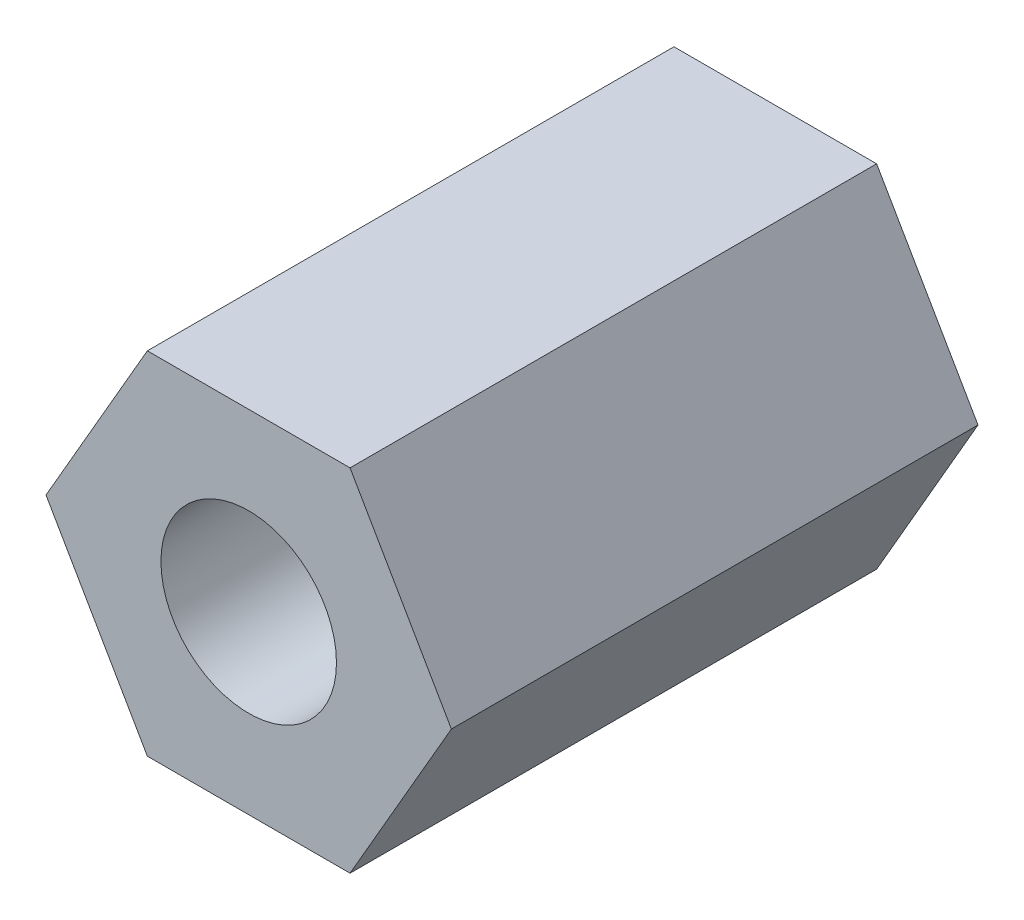
ISO-10303-21;
HEADER;
FILE_DESCRIPTION(('STEP AP214'),'2;1');
FILE_NAME('part.step','',(''),(''),'','','');
FILE_SCHEMA(('AUTOMOTIVE_DESIGN { 1 0 10303 214 1 1 1 1 }'));
ENDSEC;
DATA;
#1=APPLICATION_CONTEXT('core data for automotive mechanical design processes');
#2=APPLICATION_PROTOCOL_DEFINITION('international standard','automotive_design',2000,#1);
#3=PRODUCT_CONTEXT('',#1,'mechanical');
#4=PRODUCT('Part','Part','',(#3));
#5=PRODUCT_RELATED_PRODUCT_CATEGORY('part','',(#4));
#6=PRODUCT_DEFINITION_FORMATION('','',#4);
#7=PRODUCT_DEFINITION_CONTEXT('part definition',#1,'design');
#8=PRODUCT_DEFINITION('design','',#6,#7);
#9=PRODUCT_DEFINITION_SHAPE('','',#8);
#10=(LENGTH_UNIT() NAMED_UNIT(*) SI_UNIT(.MILLI.,.METRE.));
#11=(NAMED_UNIT(*) PLANE_ANGLE_UNIT() SI_UNIT($,.RADIAN.));
#12=(NAMED_UNIT(*) SI_UNIT($,.STERADIAN.) SOLID_ANGLE_UNIT());
#13=UNCERTAINTY_MEASURE_WITH_UNIT(LENGTH_MEASURE(1.E-05),#10,'distance_accuracy_value','');
#14=(GEOMETRIC_REPRESENTATION_CONTEXT(3) GLOBAL_UNCERTAINTY_ASSIGNED_CONTEXT((#13)) GLOBAL_UNIT_ASSIGNED_CONTEXT((#10,
#11,#12)) REPRESENTATION_CONTEXT('',''));
#15=CARTESIAN_POINT('',(0.,0.,0.));
#16=DIRECTION('',(0.,0.,1.));
#17=DIRECTION('',(1.,0.,0.));
#18=AXIS2_PLACEMENT_3D('',#15,#16,#17);
#19=CARTESIAN_POINT('',(0.,0.,9.));
#20=DIRECTION('',(0.,0.,1.));
#21=DIRECTION('',(1.,0.,0.));
#22=AXIS2_PLACEMENT_3D('',#19,#20,#21);
#23=PLANE('',#22);
#24=DIRECTION('',(0.5,0.866025403784439,0.));
#25=VECTOR('',#24,1.);
#26=CARTESIAN_POINT('',(1.73205080756888,-3.,9.));
#27=LINE('',#26,#25);
#28=CARTESIAN_POINT('',(1.73205080756888,-3.,9.));
#29=VERTEX_POINT('',#28);
#30=CARTESIAN_POINT('',(3.46410161513775,0.,9.));
#31=VERTEX_POINT('',#30);
#32=EDGE_CURVE('E146',#29,#31,#27,.T.);
#33=ORIENTED_EDGE('',*,*,#32,.T.);
#34=DIRECTION('',(-0.5,0.866025403784438,0.));
#35=VECTOR('',#34,1.);
#36=CARTESIAN_POINT('',(3.46410161513775,0.,9.));
#37=LINE('',#36,#35);
#38=CARTESIAN_POINT('',(1.73205080756888,3.,9.));
#39=VERTEX_POINT('',#38);
#40=EDGE_CURVE('E94',#31,#39,#37,.T.);
#41=ORIENTED_EDGE('',*,*,#40,.T.);
#42=DIRECTION('',(-1.,0.,0.));
#43=VECTOR('',#42,1.);
#44=CARTESIAN_POINT('',(1.73205080756888,3.,9.));
#45=LINE('',#44,#43);
#46=CARTESIAN_POINT('',(-1.73205080756888,3.,9.));
#47=VERTEX_POINT('',#46);
#48=EDGE_CURVE('E107',#39,#47,#45,.T.);
#49=ORIENTED_EDGE('',*,*,#48,.T.);
#50=DIRECTION('',(-0.5,-0.866025403784439,0.));
#51=VECTOR('',#50,1.);
#52=CARTESIAN_POINT('',(-1.73205080756888,3.,9.));
#53=LINE('',#52,#51);
#54=CARTESIAN_POINT('',(-3.46410161513776,0.,9.));
#55=VERTEX_POINT('',#54);
#56=EDGE_CURVE('E101',#47,#55,#53,.T.);
#57=ORIENTED_EDGE('',*,*,#56,.T.);
#58=DIRECTION('',(0.5,-0.866025403784438,0.));
#59=VECTOR('',#58,1.);
#60=CARTESIAN_POINT('',(-3.46410161513776,0.,9.));
#61=LINE('',#60,#59);
#62=CARTESIAN_POINT('',(-1.73205080756888,-3.,9.));
#63=VERTEX_POINT('',#62);
#64=EDGE_CURVE('E105',#55,#63,#61,.T.);
#65=ORIENTED_EDGE('',*,*,#64,.T.);
#66=DIRECTION('',(1.,0.,0.));
#67=VECTOR('',#66,1.);
#68=CARTESIAN_POINT('',(-1.73205080756888,-3.,9.));
#69=LINE('',#68,#67);
#70=EDGE_CURVE('E57',#63,#29,#69,.T.);
#71=ORIENTED_EDGE('',*,*,#70,.T.);
#72=EDGE_LOOP('',(#33,#41,#49,#57,#65,#71));
#73=FACE_BOUND('',#72,.T.);
#74=CARTESIAN_POINT('',(0.,0.,9.));
#75=DIRECTION('',(0.,0.,1.));
#76=DIRECTION('',(1.,0.,0.));
#77=AXIS2_PLACEMENT_3D('',#74,#75,#76);
#78=CIRCLE('',#77,1.5);
#79=CARTESIAN_POINT('',(1.5,0.,9.));
#80=VERTEX_POINT('',#79);
#81=EDGE_CURVE('E134',#80,#80,#78,.T.);
#82=ORIENTED_EDGE('',*,*,#81,.F.);
#83=EDGE_LOOP('',(#82));
#84=FACE_BOUND('',#83,.T.);
#85=ADVANCED_FACE('F39',(#73,#84),#23,.T.);
#86=CARTESIAN_POINT('',(0.,0.,0.));
#87=DIRECTION('',(0.,0.,1.));
#88=DIRECTION('',(1.,0.,0.));
#89=AXIS2_PLACEMENT_3D('',#86,#87,#88);
#90=PLANE('',#89);
#91=DIRECTION('',(0.5,0.866025403784439,0.));
#92=VECTOR('',#91,1.);
#93=CARTESIAN_POINT('',(1.73205080756888,-3.,0.));
#94=LINE('',#93,#92);
#95=CARTESIAN_POINT('',(1.73205080756888,-3.,0.));
#96=VERTEX_POINT('',#95);
#97=CARTESIAN_POINT('',(3.46410161513775,0.,0.));
#98=VERTEX_POINT('',#97);
#99=EDGE_CURVE('E129',#96,#98,#94,.T.);
#100=ORIENTED_EDGE('',*,*,#99,.F.);
#101=DIRECTION('',(1.,0.,0.));
#102=VECTOR('',#101,1.);
#103=CARTESIAN_POINT('',(-1.73205080756888,-3.,0.));
#104=LINE('',#103,#102);
#105=CARTESIAN_POINT('',(-1.73205080756888,-3.,0.));
#106=VERTEX_POINT('',#105);
#107=EDGE_CURVE('E86',#106,#96,#104,.T.);
#108=ORIENTED_EDGE('',*,*,#107,.F.);
#109=DIRECTION('',(0.5,-0.866025403784438,0.));
#110=VECTOR('',#109,1.);
#111=CARTESIAN_POINT('',(-3.46410161513776,0.,0.));
#112=LINE('',#111,#110);
#113=CARTESIAN_POINT('',(-3.46410161513776,0.,0.));
#114=VERTEX_POINT('',#113);
#115=EDGE_CURVE('E80',#114,#106,#112,.T.);
#116=ORIENTED_EDGE('',*,*,#115,.F.);
#117=DIRECTION('',(-0.5,-0.866025403784439,0.));
#118=VECTOR('',#117,1.);
#119=CARTESIAN_POINT('',(-1.73205080756888,3.,0.));
#120=LINE('',#119,#118);
#121=CARTESIAN_POINT('',(-1.73205080756888,3.,0.));
#122=VERTEX_POINT('',#121);
#123=EDGE_CURVE('E116',#122,#114,#120,.T.);
#124=ORIENTED_EDGE('',*,*,#123,.F.);
#125=DIRECTION('',(-1.,0.,0.));
#126=VECTOR('',#125,1.);
#127=CARTESIAN_POINT('',(1.73205080756888,3.,0.));
#128=LINE('',#127,#126);
#129=CARTESIAN_POINT('',(1.73205080756888,3.,0.));
#130=VERTEX_POINT('',#129);
#131=EDGE_CURVE('E137',#130,#122,#128,.T.);
#132=ORIENTED_EDGE('',*,*,#131,.F.);
#133=DIRECTION('',(-0.5,0.866025403784438,0.));
#134=VECTOR('',#133,1.);
#135=CARTESIAN_POINT('',(3.46410161513775,0.,0.));
#136=LINE('',#135,#134);
#137=EDGE_CURVE('E133',#98,#130,#136,.T.);
#138=ORIENTED_EDGE('',*,*,#137,.F.);
#139=EDGE_LOOP('',(#100,#108,#116,#124,#132,#138));
#140=FACE_BOUND('',#139,.T.);
#141=CARTESIAN_POINT('',(0.,0.,0.));
#142=DIRECTION('',(0.,0.,1.));
#143=DIRECTION('',(1.,0.,0.));
#144=AXIS2_PLACEMENT_3D('',#141,#142,#143);
#145=CIRCLE('',#144,1.5);
#146=CARTESIAN_POINT('',(1.5,0.,0.));
#147=VERTEX_POINT('',#146);
#148=EDGE_CURVE('E243',#147,#147,#145,.T.);
#149=ORIENTED_EDGE('',*,*,#148,.T.);
#150=EDGE_LOOP('',(#149));
#151=FACE_BOUND('',#150,.T.);
#152=ADVANCED_FACE('F159',(#140,#151),#90,.F.);
#153=CARTESIAN_POINT('',(1.73205080756888,-3.,9.));
#154=DIRECTION('',(-0.866025403784439,0.5,0.));
#155=DIRECTION('',(-0.5,-0.866025403784439,0.));
#156=AXIS2_PLACEMENT_3D('',#153,#154,#155);
#157=PLANE('',#156);
#158=ORIENTED_EDGE('',*,*,#99,.T.);
#159=DIRECTION('',(0.,0.,-1.));
#160=VECTOR('',#159,1.);
#161=CARTESIAN_POINT('',(3.46410161513775,0.,9.));
#162=LINE('',#161,#160);
#163=EDGE_CURVE('E11',#31,#98,#162,.T.);
#164=ORIENTED_EDGE('',*,*,#163,.F.);
#165=ORIENTED_EDGE('',*,*,#32,.F.);
#166=DIRECTION('',(0.,0.,-1.));
#167=VECTOR('',#166,1.);
#168=CARTESIAN_POINT('',(1.73205080756888,-3.,9.));
#169=LINE('',#168,#167);
#170=EDGE_CURVE('E125',#29,#96,#169,.T.);
#171=ORIENTED_EDGE('',*,*,#170,.T.);
#172=EDGE_LOOP('',(#158,#164,#165,#171));
#173=FACE_BOUND('',#172,.T.);
#174=ADVANCED_FACE('F41',(#173),#157,.F.);
#175=CARTESIAN_POINT('',(3.46410161513775,0.,9.));
#176=DIRECTION('',(-0.866025403784438,-0.5,0.));
#177=DIRECTION('',(0.5,-0.866025403784439,0.));
#178=AXIS2_PLACEMENT_3D('',#175,#176,#177);
#179=PLANE('',#178);
#180=ORIENTED_EDGE('',*,*,#137,.T.);
#181=DIRECTION('',(0.,0.,-1.));
#182=VECTOR('',#181,1.);
#183=CARTESIAN_POINT('',(1.73205080756888,3.,9.));
#184=LINE('',#183,#182);
#185=EDGE_CURVE('E49',#39,#130,#184,.T.);
#186=ORIENTED_EDGE('',*,*,#185,.F.);
#187=ORIENTED_EDGE('',*,*,#40,.F.);
#188=ORIENTED_EDGE('',*,*,#163,.T.);
#189=EDGE_LOOP('',(#180,#186,#187,#188));
#190=FACE_BOUND('',#189,.T.);
#191=ADVANCED_FACE('F184',(#190),#179,.F.);
#192=CARTESIAN_POINT('',(1.73205080756888,3.,9.));
#193=DIRECTION('',(0.,-1.,0.));
#194=DIRECTION('',(0.,0.,-1.));
#195=AXIS2_PLACEMENT_3D('',#192,#193,#194);
#196=PLANE('',#195);
#197=ORIENTED_EDGE('',*,*,#131,.T.);
#198=DIRECTION('',(0.,0.,-1.));
#199=VECTOR('',#198,1.);
#200=CARTESIAN_POINT('',(-1.73205080756888,3.,9.));
#201=LINE('',#200,#199);
#202=EDGE_CURVE('E118',#47,#122,#201,.T.);
#203=ORIENTED_EDGE('',*,*,#202,.F.);
#204=ORIENTED_EDGE('',*,*,#48,.F.);
#205=ORIENTED_EDGE('',*,*,#185,.T.);
#206=EDGE_LOOP('',(#197,#203,#204,#205));
#207=FACE_BOUND('',#206,.T.);
#208=ADVANCED_FACE('F156',(#207),#196,.F.);
#209=CARTESIAN_POINT('',(-1.73205080756888,3.,9.));
#210=DIRECTION('',(0.866025403784439,-0.5,0.));
#211=DIRECTION('',(0.5,0.866025403784439,0.));
#212=AXIS2_PLACEMENT_3D('',#209,#210,#211);
#213=PLANE('',#212);
#214=ORIENTED_EDGE('',*,*,#123,.T.);
#215=DIRECTION('',(0.,0.,-1.));
#216=VECTOR('',#215,1.);
#217=CARTESIAN_POINT('',(-3.46410161513776,0.,9.));
#218=LINE('',#217,#216);
#219=EDGE_CURVE('E113',#55,#114,#218,.T.);
#220=ORIENTED_EDGE('',*,*,#219,.F.);
#221=ORIENTED_EDGE('',*,*,#56,.F.);
#222=ORIENTED_EDGE('',*,*,#202,.T.);
#223=EDGE_LOOP('',(#214,#220,#221,#222));
#224=FACE_BOUND('',#223,.T.);
#225=ADVANCED_FACE('F114',(#224),#213,.F.);
#226=CARTESIAN_POINT('',(-3.46410161513776,0.,9.));
#227=DIRECTION('',(0.866025403784439,0.5,0.));
#228=DIRECTION('',(-0.5,0.866025403784439,0.));
#229=AXIS2_PLACEMENT_3D('',#226,#227,#228);
#230=PLANE('',#229);
#231=ORIENTED_EDGE('',*,*,#115,.T.);
#232=DIRECTION('',(0.,0.,-1.));
#233=VECTOR('',#232,1.);
#234=CARTESIAN_POINT('',(-1.73205080756888,-3.,9.));
#235=LINE('',#234,#233);
#236=EDGE_CURVE('E119',#63,#106,#235,.T.);
#237=ORIENTED_EDGE('',*,*,#236,.F.);
#238=ORIENTED_EDGE('',*,*,#64,.F.);
#239=ORIENTED_EDGE('',*,*,#219,.T.);
#240=EDGE_LOOP('',(#231,#237,#238,#239));
#241=FACE_BOUND('',#240,.T.);
#242=ADVANCED_FACE('F121',(#241),#230,.F.);
#243=CARTESIAN_POINT('',(-1.73205080756888,-3.,9.));
#244=DIRECTION('',(0.,1.,0.));
#245=DIRECTION('',(-1.,0.,0.));
#246=AXIS2_PLACEMENT_3D('',#243,#244,#245);
#247=PLANE('',#246);
#248=ORIENTED_EDGE('',*,*,#107,.T.);
#249=ORIENTED_EDGE('',*,*,#170,.F.);
#250=ORIENTED_EDGE('',*,*,#70,.F.);
#251=ORIENTED_EDGE('',*,*,#236,.T.);
#252=EDGE_LOOP('',(#248,#249,#250,#251));
#253=FACE_BOUND('',#252,.T.);
#254=ADVANCED_FACE('F164',(#253),#247,.F.);
#255=CARTESIAN_POINT('',(0.,0.,9.));
#256=DIRECTION('',(0.,0.,-1.));
#257=DIRECTION('',(-1.,0.,0.));
#258=AXIS2_PLACEMENT_3D('',#255,#256,#257);
#259=CYLINDRICAL_SURFACE('',#258,1.5);
#260=ORIENTED_EDGE('',*,*,#81,.T.);
#261=EDGE_LOOP('',(#260));
#262=FACE_BOUND('',#261,.T.);
#263=ORIENTED_EDGE('',*,*,#148,.F.);
#264=EDGE_LOOP('',(#263));
#265=FACE_BOUND('',#264,.T.);
#266=ADVANCED_FACE('F166',(#262,#265),#259,.F.);
#267=CLOSED_SHELL('',(#85,#152,#174,#191,#208,#225,#242,#254,#266));
#268=MANIFOLD_SOLID_BREP('B2',#267);
#269=ADVANCED_BREP_SHAPE_REPRESENTATION('',(#18,#268),#14);
#270=SHAPE_DEFINITION_REPRESENTATION(#9,#269);
ENDSEC;
END-ISO-10303-21;
